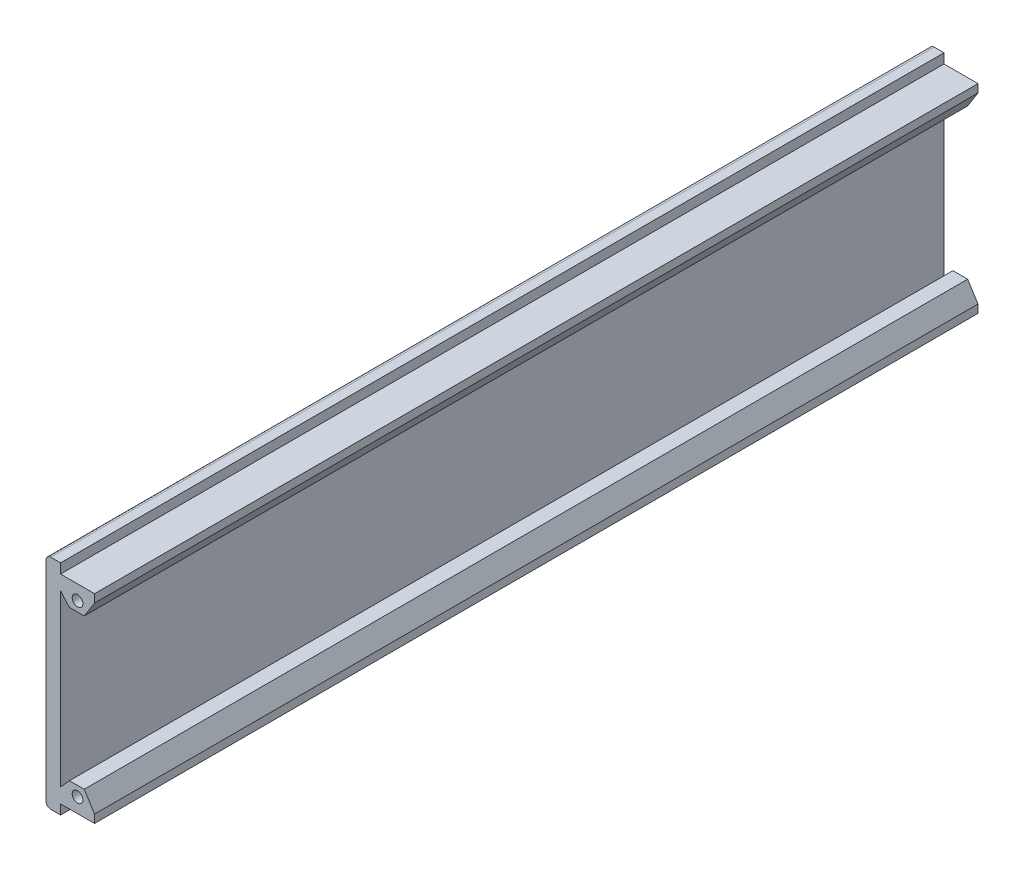
ISO-10303-21;
HEADER;
FILE_DESCRIPTION(('STEP AP214'),'2;1');
FILE_NAME('part.step','',(''),(''),'','','');
FILE_SCHEMA(('AUTOMOTIVE_DESIGN { 1 0 10303 214 1 1 1 1 }'));
ENDSEC;
DATA;
#1=APPLICATION_CONTEXT('core data for automotive mechanical design processes');
#2=APPLICATION_PROTOCOL_DEFINITION('international standard','automotive_design',2000,#1);
#3=PRODUCT_CONTEXT('',#1,'mechanical');
#4=PRODUCT('Part','Part','',(#3));
#5=PRODUCT_RELATED_PRODUCT_CATEGORY('part','',(#4));
#6=PRODUCT_DEFINITION_FORMATION('','',#4);
#7=PRODUCT_DEFINITION_CONTEXT('part definition',#1,'design');
#8=PRODUCT_DEFINITION('design','',#6,#7);
#9=PRODUCT_DEFINITION_SHAPE('','',#8);
#10=(LENGTH_UNIT() NAMED_UNIT(*) SI_UNIT(.MILLI.,.METRE.));
#11=(NAMED_UNIT(*) PLANE_ANGLE_UNIT() SI_UNIT($,.RADIAN.));
#12=(NAMED_UNIT(*) SI_UNIT($,.STERADIAN.) SOLID_ANGLE_UNIT());
#13=UNCERTAINTY_MEASURE_WITH_UNIT(LENGTH_MEASURE(1.E-05),#10,'distance_accuracy_value','');
#14=(GEOMETRIC_REPRESENTATION_CONTEXT(3) GLOBAL_UNCERTAINTY_ASSIGNED_CONTEXT((#13)) GLOBAL_UNIT_ASSIGNED_CONTEXT((#10,
#11,#12)) REPRESENTATION_CONTEXT('',''));
#15=CARTESIAN_POINT('',(0.,0.,0.));
#16=DIRECTION('',(0.,0.,1.));
#17=DIRECTION('',(1.,0.,0.));
#18=AXIS2_PLACEMENT_3D('',#15,#16,#17);
#19=CARTESIAN_POINT('',(0.,45.,182.));
#20=DIRECTION('',(0.,1.,0.));
#21=DIRECTION('',(0.,0.,1.));
#22=AXIS2_PLACEMENT_3D('',#19,#20,#21);
#23=PLANE('',#22);
#24=DIRECTION('',(1.,0.,0.));
#25=VECTOR('',#24,1.);
#26=CARTESIAN_POINT('',(0.,45.,0.));
#27=LINE('',#26,#25);
#28=CARTESIAN_POINT('',(1.,45.,0.));
#29=VERTEX_POINT('',#28);
#30=CARTESIAN_POINT('',(3.,45.,0.));
#31=VERTEX_POINT('',#30);
#32=EDGE_CURVE('E193',#29,#31,#27,.T.);
#33=ORIENTED_EDGE('',*,*,#32,.F.);
#34=DIRECTION('',(0.,0.,-1.));
#35=VECTOR('',#34,1.);
#36=CARTESIAN_POINT('',(1.,45.,182.));
#37=LINE('',#36,#35);
#38=CARTESIAN_POINT('',(1.,45.,182.));
#39=VERTEX_POINT('',#38);
#40=EDGE_CURVE('E11',#39,#29,#37,.T.);
#41=ORIENTED_EDGE('',*,*,#40,.F.);
#42=DIRECTION('',(1.,0.,0.));
#43=VECTOR('',#42,1.);
#44=CARTESIAN_POINT('',(0.,45.,182.));
#45=LINE('',#44,#43);
#46=CARTESIAN_POINT('',(3.,45.,182.));
#47=VERTEX_POINT('',#46);
#48=EDGE_CURVE('E242',#39,#47,#45,.T.);
#49=ORIENTED_EDGE('',*,*,#48,.T.);
#50=DIRECTION('',(0.,0.,-1.));
#51=VECTOR('',#50,1.);
#52=CARTESIAN_POINT('',(3.,45.,182.));
#53=LINE('',#52,#51);
#54=EDGE_CURVE('E112',#47,#31,#53,.T.);
#55=ORIENTED_EDGE('',*,*,#54,.T.);
#56=EDGE_LOOP('',(#33,#41,#49,#55));
#57=FACE_BOUND('',#56,.T.);
#58=ADVANCED_FACE('F32',(#57),#23,.T.);
#59=CARTESIAN_POINT('',(1.,44.,182.));
#60=DIRECTION('',(0.,0.,-1.));
#61=DIRECTION('',(-1.,0.,0.));
#62=AXIS2_PLACEMENT_3D('',#59,#60,#61);
#63=CYLINDRICAL_SURFACE('',#62,1.);
#64=CARTESIAN_POINT('',(1.,44.,0.));
#65=DIRECTION('',(0.,0.,1.));
#66=DIRECTION('',(1.,0.,0.));
#67=AXIS2_PLACEMENT_3D('',#64,#65,#66);
#68=CIRCLE('',#67,1.);
#69=CARTESIAN_POINT('',(0.,44.,0.));
#70=VERTEX_POINT('',#69);
#71=EDGE_CURVE('E196',#29,#70,#68,.T.);
#72=ORIENTED_EDGE('',*,*,#71,.T.);
#73=DIRECTION('',(0.,0.,-1.));
#74=VECTOR('',#73,1.);
#75=CARTESIAN_POINT('',(0.,44.,182.));
#76=LINE('',#75,#74);
#77=CARTESIAN_POINT('',(0.,44.,182.));
#78=VERTEX_POINT('',#77);
#79=EDGE_CURVE('E40',#78,#70,#76,.T.);
#80=ORIENTED_EDGE('',*,*,#79,.F.);
#81=CARTESIAN_POINT('',(1.,44.,182.));
#82=DIRECTION('',(0.,0.,1.));
#83=DIRECTION('',(1.,0.,0.));
#84=AXIS2_PLACEMENT_3D('',#81,#82,#83);
#85=CIRCLE('',#84,1.);
#86=EDGE_CURVE('E298',#39,#78,#85,.T.);
#87=ORIENTED_EDGE('',*,*,#86,.F.);
#88=ORIENTED_EDGE('',*,*,#40,.T.);
#89=EDGE_LOOP('',(#72,#80,#87,#88));
#90=FACE_BOUND('',#89,.T.);
#91=ADVANCED_FACE('F285',(#90),#63,.T.);
#92=CARTESIAN_POINT('',(0.,0.,182.));
#93=DIRECTION('',(-1.,0.,0.));
#94=DIRECTION('',(0.,0.,1.));
#95=AXIS2_PLACEMENT_3D('',#92,#93,#94);
#96=PLANE('',#95);
#97=DIRECTION('',(0.,1.,0.));
#98=VECTOR('',#97,1.);
#99=CARTESIAN_POINT('',(0.,0.,0.));
#100=LINE('',#99,#98);
#101=CARTESIAN_POINT('',(0.,1.00000000000001,0.));
#102=VERTEX_POINT('',#101);
#103=EDGE_CURVE('E199',#102,#70,#100,.T.);
#104=ORIENTED_EDGE('',*,*,#103,.F.);
#105=DIRECTION('',(0.,0.,-1.));
#106=VECTOR('',#105,1.);
#107=CARTESIAN_POINT('',(0.,1.00000000000001,182.));
#108=LINE('',#107,#106);
#109=CARTESIAN_POINT('',(0.,1.00000000000001,182.));
#110=VERTEX_POINT('',#109);
#111=EDGE_CURVE('E275',#110,#102,#108,.T.);
#112=ORIENTED_EDGE('',*,*,#111,.F.);
#113=DIRECTION('',(0.,1.,0.));
#114=VECTOR('',#113,1.);
#115=CARTESIAN_POINT('',(0.,0.,182.));
#116=LINE('',#115,#114);
#117=EDGE_CURVE('E282',#110,#78,#116,.T.);
#118=ORIENTED_EDGE('',*,*,#117,.T.);
#119=ORIENTED_EDGE('',*,*,#79,.T.);
#120=EDGE_LOOP('',(#104,#112,#118,#119));
#121=FACE_BOUND('',#120,.T.);
#122=ADVANCED_FACE('F280',(#121),#96,.T.);
#123=CARTESIAN_POINT('',(1.,1.,182.));
#124=DIRECTION('',(0.,0.,-1.));
#125=DIRECTION('',(-1.,0.,0.));
#126=AXIS2_PLACEMENT_3D('',#123,#124,#125);
#127=CYLINDRICAL_SURFACE('',#126,1.);
#128=CARTESIAN_POINT('',(1.,1.,0.));
#129=DIRECTION('',(0.,0.,1.));
#130=DIRECTION('',(1.,0.,0.));
#131=AXIS2_PLACEMENT_3D('',#128,#129,#130);
#132=CIRCLE('',#131,1.);
#133=CARTESIAN_POINT('',(1.00000000000001,0.,0.));
#134=VERTEX_POINT('',#133);
#135=EDGE_CURVE('E202',#134,#102,#132,.F.);
#136=ORIENTED_EDGE('',*,*,#135,.F.);
#137=DIRECTION('',(0.,0.,-1.));
#138=VECTOR('',#137,1.);
#139=CARTESIAN_POINT('',(1.00000000000001,0.,182.));
#140=LINE('',#139,#138);
#141=CARTESIAN_POINT('',(1.00000000000001,0.,182.));
#142=VERTEX_POINT('',#141);
#143=EDGE_CURVE('E273',#142,#134,#140,.T.);
#144=ORIENTED_EDGE('',*,*,#143,.F.);
#145=CARTESIAN_POINT('',(1.,1.,182.));
#146=DIRECTION('',(0.,0.,1.));
#147=DIRECTION('',(1.,0.,0.));
#148=AXIS2_PLACEMENT_3D('',#145,#146,#147);
#149=CIRCLE('',#148,1.);
#150=EDGE_CURVE('E297',#142,#110,#149,.F.);
#151=ORIENTED_EDGE('',*,*,#150,.T.);
#152=ORIENTED_EDGE('',*,*,#111,.T.);
#153=EDGE_LOOP('',(#136,#144,#151,#152));
#154=FACE_BOUND('',#153,.T.);
#155=ADVANCED_FACE('F293',(#154),#127,.T.);
#156=CARTESIAN_POINT('',(0.,0.,182.));
#157=DIRECTION('',(0.,1.,0.));
#158=DIRECTION('',(0.,0.,1.));
#159=AXIS2_PLACEMENT_3D('',#156,#157,#158);
#160=PLANE('',#159);
#161=DIRECTION('',(1.,0.,0.));
#162=VECTOR('',#161,1.);
#163=CARTESIAN_POINT('',(0.,0.,0.));
#164=LINE('',#163,#162);
#165=CARTESIAN_POINT('',(3.,0.,0.));
#166=VERTEX_POINT('',#165);
#167=EDGE_CURVE('E205',#134,#166,#164,.T.);
#168=ORIENTED_EDGE('',*,*,#167,.T.);
#169=DIRECTION('',(0.,0.,-1.));
#170=VECTOR('',#169,1.);
#171=CARTESIAN_POINT('',(3.,0.,182.));
#172=LINE('',#171,#170);
#173=CARTESIAN_POINT('',(3.,0.,182.));
#174=VERTEX_POINT('',#173);
#175=EDGE_CURVE('E270',#174,#166,#172,.T.);
#176=ORIENTED_EDGE('',*,*,#175,.F.);
#177=DIRECTION('',(1.,0.,0.));
#178=VECTOR('',#177,1.);
#179=CARTESIAN_POINT('',(0.,0.,182.));
#180=LINE('',#179,#178);
#181=EDGE_CURVE('E300',#142,#174,#180,.T.);
#182=ORIENTED_EDGE('',*,*,#181,.F.);
#183=ORIENTED_EDGE('',*,*,#143,.T.);
#184=EDGE_LOOP('',(#168,#176,#182,#183));
#185=FACE_BOUND('',#184,.T.);
#186=ADVANCED_FACE('F341',(#185),#160,.F.);
#187=CARTESIAN_POINT('',(3.,0.,182.));
#188=DIRECTION('',(-1.,0.,0.));
#189=DIRECTION('',(0.,0.,1.));
#190=AXIS2_PLACEMENT_3D('',#187,#188,#189);
#191=PLANE('',#190);
#192=DIRECTION('',(0.,1.,0.));
#193=VECTOR('',#192,1.);
#194=CARTESIAN_POINT('',(3.,0.,0.));
#195=LINE('',#194,#193);
#196=CARTESIAN_POINT('',(3.,2.,0.));
#197=VERTEX_POINT('',#196);
#198=EDGE_CURVE('E207',#166,#197,#195,.T.);
#199=ORIENTED_EDGE('',*,*,#198,.T.);
#200=DIRECTION('',(0.,0.,-1.));
#201=VECTOR('',#200,1.);
#202=CARTESIAN_POINT('',(3.,2.,182.));
#203=LINE('',#202,#201);
#204=CARTESIAN_POINT('',(3.,2.,182.));
#205=VERTEX_POINT('',#204);
#206=EDGE_CURVE('E267',#205,#197,#203,.T.);
#207=ORIENTED_EDGE('',*,*,#206,.F.);
#208=DIRECTION('',(0.,1.,0.));
#209=VECTOR('',#208,1.);
#210=CARTESIAN_POINT('',(3.,0.,182.));
#211=LINE('',#210,#209);
#212=EDGE_CURVE('E306',#174,#205,#211,.T.);
#213=ORIENTED_EDGE('',*,*,#212,.F.);
#214=ORIENTED_EDGE('',*,*,#175,.T.);
#215=EDGE_LOOP('',(#199,#207,#213,#214));
#216=FACE_BOUND('',#215,.T.);
#217=ADVANCED_FACE('F344',(#216),#191,.F.);
#218=CARTESIAN_POINT('',(0.,2.,182.));
#219=DIRECTION('',(0.,1.,0.));
#220=DIRECTION('',(0.,0.,1.));
#221=AXIS2_PLACEMENT_3D('',#218,#219,#220);
#222=PLANE('',#221);
#223=DIRECTION('',(1.,0.,0.));
#224=VECTOR('',#223,1.);
#225=CARTESIAN_POINT('',(0.,2.,0.));
#226=LINE('',#225,#224);
#227=CARTESIAN_POINT('',(10.,2.,0.));
#228=VERTEX_POINT('',#227);
#229=EDGE_CURVE('E209',#197,#228,#226,.T.);
#230=ORIENTED_EDGE('',*,*,#229,.T.);
#231=DIRECTION('',(0.,0.,-1.));
#232=VECTOR('',#231,1.);
#233=CARTESIAN_POINT('',(10.,2.,182.));
#234=LINE('',#233,#232);
#235=CARTESIAN_POINT('',(10.,2.,182.));
#236=VERTEX_POINT('',#235);
#237=EDGE_CURVE('E264',#236,#228,#234,.T.);
#238=ORIENTED_EDGE('',*,*,#237,.F.);
#239=DIRECTION('',(1.,0.,0.));
#240=VECTOR('',#239,1.);
#241=CARTESIAN_POINT('',(0.,2.,182.));
#242=LINE('',#241,#240);
#243=EDGE_CURVE('E308',#205,#236,#242,.T.);
#244=ORIENTED_EDGE('',*,*,#243,.F.);
#245=ORIENTED_EDGE('',*,*,#206,.T.);
#246=EDGE_LOOP('',(#230,#238,#244,#245));
#247=FACE_BOUND('',#246,.T.);
#248=ADVANCED_FACE('F348',(#247),#222,.F.);
#249=CARTESIAN_POINT('',(10.,0.,182.));
#250=DIRECTION('',(-1.,0.,0.));
#251=DIRECTION('',(0.,0.,1.));
#252=AXIS2_PLACEMENT_3D('',#249,#250,#251);
#253=PLANE('',#252);
#254=DIRECTION('',(0.,1.,0.));
#255=VECTOR('',#254,1.);
#256=CARTESIAN_POINT('',(10.,0.,0.));
#257=LINE('',#256,#255);
#258=CARTESIAN_POINT('',(10.,3.67579682857385,0.));
#259=VERTEX_POINT('',#258);
#260=EDGE_CURVE('E211',#228,#259,#257,.T.);
#261=ORIENTED_EDGE('',*,*,#260,.T.);
#262=DIRECTION('',(0.,0.,-1.));
#263=VECTOR('',#262,1.);
#264=CARTESIAN_POINT('',(10.,3.67579682857385,182.));
#265=LINE('',#264,#263);
#266=CARTESIAN_POINT('',(10.,3.67579682857385,182.));
#267=VERTEX_POINT('',#266);
#268=EDGE_CURVE('E261',#267,#259,#265,.T.);
#269=ORIENTED_EDGE('',*,*,#268,.F.);
#270=DIRECTION('',(0.,1.,0.));
#271=VECTOR('',#270,1.);
#272=CARTESIAN_POINT('',(10.,0.,182.));
#273=LINE('',#272,#271);
#274=EDGE_CURVE('E310',#236,#267,#273,.T.);
#275=ORIENTED_EDGE('',*,*,#274,.F.);
#276=ORIENTED_EDGE('',*,*,#237,.T.);
#277=EDGE_LOOP('',(#261,#269,#275,#276));
#278=FACE_BOUND('',#277,.T.);
#279=ADVANCED_FACE('F352',(#278),#253,.F.);
#280=CARTESIAN_POINT('',(8.81045851732208,5.56056902407851,182.));
#281=DIRECTION('',(-0.845659214489006,-0.533723236284347,0.));
#282=DIRECTION('',(0.533723236284347,-0.845659214489006,0.));
#283=AXIS2_PLACEMENT_3D('',#280,#281,#282);
#284=PLANE('',#283);
#285=DIRECTION('',(-0.533723236284347,0.845659214489006,0.));
#286=VECTOR('',#285,1.);
#287=CARTESIAN_POINT('',(8.81045851732208,5.56056902407851,0.));
#288=LINE('',#287,#286);
#289=CARTESIAN_POINT('',(7.87348653181208,7.04515680178294,0.));
#290=VERTEX_POINT('',#289);
#291=EDGE_CURVE('E213',#259,#290,#288,.T.);
#292=ORIENTED_EDGE('',*,*,#291,.T.);
#293=DIRECTION('',(0.,0.,-1.));
#294=VECTOR('',#293,1.);
#295=CARTESIAN_POINT('',(7.87348653181208,7.04515680178294,182.));
#296=LINE('',#295,#294);
#297=CARTESIAN_POINT('',(7.87348653181208,7.04515680178294,182.));
#298=VERTEX_POINT('',#297);
#299=EDGE_CURVE('E258',#298,#290,#296,.T.);
#300=ORIENTED_EDGE('',*,*,#299,.F.);
#301=DIRECTION('',(-0.533723236284347,0.845659214489006,0.));
#302=VECTOR('',#301,1.);
#303=CARTESIAN_POINT('',(8.81045851732208,5.56056902407851,182.));
#304=LINE('',#303,#302);
#305=EDGE_CURVE('E312',#267,#298,#304,.T.);
#306=ORIENTED_EDGE('',*,*,#305,.F.);
#307=ORIENTED_EDGE('',*,*,#268,.T.);
#308=EDGE_LOOP('',(#292,#300,#306,#307));
#309=FACE_BOUND('',#308,.T.);
#310=ADVANCED_FACE('F356',(#309),#284,.F.);
#311=CARTESIAN_POINT('',(0.,7.04515680178293,182.));
#312=DIRECTION('',(0.,-1.,0.));
#313=DIRECTION('',(1.,0.,0.));
#314=AXIS2_PLACEMENT_3D('',#311,#312,#313);
#315=PLANE('',#314);
#316=DIRECTION('',(-1.,0.,0.));
#317=VECTOR('',#316,1.);
#318=CARTESIAN_POINT('',(0.,7.04515680178293,0.));
#319=LINE('',#318,#317);
#320=CARTESIAN_POINT('',(4.83298828549779,7.04515680178294,0.));
#321=VERTEX_POINT('',#320);
#322=EDGE_CURVE('E215',#290,#321,#319,.T.);
#323=ORIENTED_EDGE('',*,*,#322,.T.);
#324=DIRECTION('',(0.,0.,-1.));
#325=VECTOR('',#324,1.);
#326=CARTESIAN_POINT('',(4.83298828549779,7.04515680178294,182.));
#327=LINE('',#326,#325);
#328=CARTESIAN_POINT('',(4.83298828549779,7.04515680178294,182.));
#329=VERTEX_POINT('',#328);
#330=EDGE_CURVE('E255',#329,#321,#327,.T.);
#331=ORIENTED_EDGE('',*,*,#330,.F.);
#332=DIRECTION('',(-1.,0.,0.));
#333=VECTOR('',#332,1.);
#334=CARTESIAN_POINT('',(0.,7.04515680178293,182.));
#335=LINE('',#334,#333);
#336=EDGE_CURVE('E314',#298,#329,#335,.T.);
#337=ORIENTED_EDGE('',*,*,#336,.F.);
#338=ORIENTED_EDGE('',*,*,#299,.T.);
#339=EDGE_LOOP('',(#323,#331,#337,#338));
#340=FACE_BOUND('',#339,.T.);
#341=ADVANCED_FACE('F360',(#340),#315,.F.);
#342=CARTESIAN_POINT('',(-0.821442901153496,0.736224828192653,182.));
#343=DIRECTION('',(0.744678121456359,-0.667423774991742,0.));
#344=DIRECTION('',(0.667423774991742,0.744678121456359,0.));
#345=AXIS2_PLACEMENT_3D('',#342,#343,#344);
#346=PLANE('',#345);
#347=DIRECTION('',(-0.667423774991742,-0.744678121456359,0.));
#348=VECTOR('',#347,1.);
#349=CARTESIAN_POINT('',(-0.821442901153496,0.736224828192653,0.));
#350=LINE('',#349,#348);
#351=CARTESIAN_POINT('',(3.,5.,0.));
#352=VERTEX_POINT('',#351);
#353=EDGE_CURVE('E217',#321,#352,#350,.T.);
#354=ORIENTED_EDGE('',*,*,#353,.T.);
#355=DIRECTION('',(0.,0.,-1.));
#356=VECTOR('',#355,1.);
#357=CARTESIAN_POINT('',(3.,5.,182.));
#358=LINE('',#357,#356);
#359=CARTESIAN_POINT('',(3.,5.,182.));
#360=VERTEX_POINT('',#359);
#361=EDGE_CURVE('E252',#360,#352,#358,.T.);
#362=ORIENTED_EDGE('',*,*,#361,.F.);
#363=DIRECTION('',(-0.667423774991742,-0.744678121456359,0.));
#364=VECTOR('',#363,1.);
#365=CARTESIAN_POINT('',(-0.821442901153496,0.736224828192653,182.));
#366=LINE('',#365,#364);
#367=EDGE_CURVE('E316',#329,#360,#366,.T.);
#368=ORIENTED_EDGE('',*,*,#367,.F.);
#369=ORIENTED_EDGE('',*,*,#330,.T.);
#370=EDGE_LOOP('',(#354,#362,#368,#369));
#371=FACE_BOUND('',#370,.T.);
#372=ADVANCED_FACE('F364',(#371),#346,.F.);
#373=CARTESIAN_POINT('',(3.,0.,182.));
#374=DIRECTION('',(-1.,0.,0.));
#375=DIRECTION('',(0.,0.,1.));
#376=AXIS2_PLACEMENT_3D('',#373,#374,#375);
#377=PLANE('',#376);
#378=DIRECTION('',(0.,1.,0.));
#379=VECTOR('',#378,1.);
#380=CARTESIAN_POINT('',(3.,0.,0.));
#381=LINE('',#380,#379);
#382=CARTESIAN_POINT('',(3.,40.,0.));
#383=VERTEX_POINT('',#382);
#384=EDGE_CURVE('E219',#352,#383,#381,.T.);
#385=ORIENTED_EDGE('',*,*,#384,.T.);
#386=DIRECTION('',(0.,0.,-1.));
#387=VECTOR('',#386,1.);
#388=CARTESIAN_POINT('',(3.,40.,182.));
#389=LINE('',#388,#387);
#390=CARTESIAN_POINT('',(3.,40.,182.));
#391=VERTEX_POINT('',#390);
#392=EDGE_CURVE('E250',#391,#383,#389,.T.);
#393=ORIENTED_EDGE('',*,*,#392,.F.);
#394=DIRECTION('',(0.,1.,0.));
#395=VECTOR('',#394,1.);
#396=CARTESIAN_POINT('',(3.,0.,182.));
#397=LINE('',#396,#395);
#398=EDGE_CURVE('E318',#360,#391,#397,.T.);
#399=ORIENTED_EDGE('',*,*,#398,.F.);
#400=ORIENTED_EDGE('',*,*,#361,.T.);
#401=EDGE_LOOP('',(#385,#393,#399,#400));
#402=FACE_BOUND('',#401,.T.);
#403=ADVANCED_FACE('F368',(#402),#377,.F.);
#404=CARTESIAN_POINT('',(21.5442718327738,19.3092274658977,182.));
#405=DIRECTION('',(-0.744678121456358,-0.667423774991743,0.));
#406=DIRECTION('',(0.667423774991743,-0.744678121456358,0.));
#407=AXIS2_PLACEMENT_3D('',#404,#405,#406);
#408=PLANE('',#407);
#409=DIRECTION('',(-0.667423774991743,0.744678121456358,0.));
#410=VECTOR('',#409,1.);
#411=CARTESIAN_POINT('',(21.5442718327738,19.3092274658977,0.));
#412=LINE('',#411,#410);
#413=CARTESIAN_POINT('',(4.83298828549779,37.9548431982171,0.));
#414=VERTEX_POINT('',#413);
#415=EDGE_CURVE('E222',#414,#383,#412,.T.);
#416=ORIENTED_EDGE('',*,*,#415,.F.);
#417=DIRECTION('',(0.,0.,-1.));
#418=VECTOR('',#417,1.);
#419=CARTESIAN_POINT('',(4.83298828549779,37.9548431982171,182.));
#420=LINE('',#419,#418);
#421=CARTESIAN_POINT('',(4.83298828549779,37.9548431982171,182.));
#422=VERTEX_POINT('',#421);
#423=EDGE_CURVE('E248',#422,#414,#420,.T.);
#424=ORIENTED_EDGE('',*,*,#423,.F.);
#425=DIRECTION('',(-0.667423774991743,0.744678121456358,0.));
#426=VECTOR('',#425,1.);
#427=CARTESIAN_POINT('',(21.5442718327738,19.3092274658977,182.));
#428=LINE('',#427,#426);
#429=EDGE_CURVE('E320',#422,#391,#428,.T.);
#430=ORIENTED_EDGE('',*,*,#429,.T.);
#431=ORIENTED_EDGE('',*,*,#392,.T.);
#432=EDGE_LOOP('',(#416,#424,#430,#431));
#433=FACE_BOUND('',#432,.T.);
#434=ADVANCED_FACE('F372',(#433),#408,.T.);
#435=CARTESIAN_POINT('',(0.,37.9548431982171,182.));
#436=DIRECTION('',(0.,-1.,0.));
#437=DIRECTION('',(0.,0.,-1.));
#438=AXIS2_PLACEMENT_3D('',#435,#436,#437);
#439=PLANE('',#438);
#440=DIRECTION('',(-1.,0.,0.));
#441=VECTOR('',#440,1.);
#442=CARTESIAN_POINT('',(0.,37.9548431982171,0.));
#443=LINE('',#442,#441);
#444=CARTESIAN_POINT('',(7.87348653181208,37.9548431982171,0.));
#445=VERTEX_POINT('',#444);
#446=EDGE_CURVE('E225',#445,#414,#443,.T.);
#447=ORIENTED_EDGE('',*,*,#446,.F.);
#448=DIRECTION('',(0.,0.,-1.));
#449=VECTOR('',#448,1.);
#450=CARTESIAN_POINT('',(7.87348653181208,37.9548431982171,182.));
#451=LINE('',#450,#449);
#452=CARTESIAN_POINT('',(7.87348653181208,37.9548431982171,182.));
#453=VERTEX_POINT('',#452);
#454=EDGE_CURVE('E246',#453,#445,#451,.T.);
#455=ORIENTED_EDGE('',*,*,#454,.F.);
#456=DIRECTION('',(-1.,0.,0.));
#457=VECTOR('',#456,1.);
#458=CARTESIAN_POINT('',(0.,37.9548431982171,182.));
#459=LINE('',#458,#457);
#460=EDGE_CURVE('E323',#453,#422,#459,.T.);
#461=ORIENTED_EDGE('',*,*,#460,.T.);
#462=ORIENTED_EDGE('',*,*,#423,.T.);
#463=EDGE_LOOP('',(#447,#455,#461,#462));
#464=FACE_BOUND('',#463,.T.);
#465=ADVANCED_FACE('F376',(#464),#439,.T.);
#466=CARTESIAN_POINT('',(-11.5002002564617,7.25815315866415,182.));
#467=DIRECTION('',(0.845659214489006,-0.533723236284347,0.));
#468=DIRECTION('',(0.533723236284347,0.845659214489006,0.));
#469=AXIS2_PLACEMENT_3D('',#466,#467,#468);
#470=PLANE('',#469);
#471=DIRECTION('',(-0.533723236284347,-0.845659214489006,0.));
#472=VECTOR('',#471,1.);
#473=CARTESIAN_POINT('',(-11.5002002564617,7.25815315866415,0.));
#474=LINE('',#473,#472);
#475=CARTESIAN_POINT('',(10.,41.3242031714262,0.));
#476=VERTEX_POINT('',#475);
#477=EDGE_CURVE('E228',#476,#445,#474,.T.);
#478=ORIENTED_EDGE('',*,*,#477,.F.);
#479=DIRECTION('',(0.,0.,-1.));
#480=VECTOR('',#479,1.);
#481=CARTESIAN_POINT('',(10.,41.3242031714262,182.));
#482=LINE('',#481,#480);
#483=CARTESIAN_POINT('',(10.,41.3242031714262,182.));
#484=VERTEX_POINT('',#483);
#485=EDGE_CURVE('E172',#484,#476,#482,.T.);
#486=ORIENTED_EDGE('',*,*,#485,.F.);
#487=DIRECTION('',(-0.533723236284347,-0.845659214489006,0.));
#488=VECTOR('',#487,1.);
#489=CARTESIAN_POINT('',(-11.5002002564617,7.25815315866415,182.));
#490=LINE('',#489,#488);
#491=EDGE_CURVE('E180',#484,#453,#490,.T.);
#492=ORIENTED_EDGE('',*,*,#491,.T.);
#493=ORIENTED_EDGE('',*,*,#454,.T.);
#494=EDGE_LOOP('',(#478,#486,#492,#493));
#495=FACE_BOUND('',#494,.T.);
#496=ADVANCED_FACE('F327',(#495),#470,.T.);
#497=CARTESIAN_POINT('',(10.,0.,182.));
#498=DIRECTION('',(1.,0.,0.));
#499=DIRECTION('',(0.,0.,-1.));
#500=AXIS2_PLACEMENT_3D('',#497,#498,#499);
#501=PLANE('',#500);
#502=DIRECTION('',(0.,-1.,0.));
#503=VECTOR('',#502,1.);
#504=CARTESIAN_POINT('',(10.,0.,0.));
#505=LINE('',#504,#503);
#506=CARTESIAN_POINT('',(10.,43.,0.));
#507=VERTEX_POINT('',#506);
#508=EDGE_CURVE('E167',#507,#476,#505,.T.);
#509=ORIENTED_EDGE('',*,*,#508,.F.);
#510=DIRECTION('',(0.,0.,-1.));
#511=VECTOR('',#510,1.);
#512=CARTESIAN_POINT('',(10.,43.,182.));
#513=LINE('',#512,#511);
#514=CARTESIAN_POINT('',(10.,43.,182.));
#515=VERTEX_POINT('',#514);
#516=EDGE_CURVE('E162',#515,#507,#513,.T.);
#517=ORIENTED_EDGE('',*,*,#516,.F.);
#518=DIRECTION('',(0.,-1.,0.));
#519=VECTOR('',#518,1.);
#520=CARTESIAN_POINT('',(10.,0.,182.));
#521=LINE('',#520,#519);
#522=EDGE_CURVE('E165',#515,#484,#521,.T.);
#523=ORIENTED_EDGE('',*,*,#522,.T.);
#524=ORIENTED_EDGE('',*,*,#485,.T.);
#525=EDGE_LOOP('',(#509,#517,#523,#524));
#526=FACE_BOUND('',#525,.T.);
#527=ADVANCED_FACE('F164',(#526),#501,.T.);
#528=CARTESIAN_POINT('',(0.,43.,182.));
#529=DIRECTION('',(0.,1.,0.));
#530=DIRECTION('',(0.,0.,1.));
#531=AXIS2_PLACEMENT_3D('',#528,#529,#530);
#532=PLANE('',#531);
#533=DIRECTION('',(1.,0.,0.));
#534=VECTOR('',#533,1.);
#535=CARTESIAN_POINT('',(0.,43.,0.));
#536=LINE('',#535,#534);
#537=CARTESIAN_POINT('',(3.,43.,0.));
#538=VERTEX_POINT('',#537);
#539=EDGE_CURVE('E232',#538,#507,#536,.T.);
#540=ORIENTED_EDGE('',*,*,#539,.F.);
#541=DIRECTION('',(0.,0.,-1.));
#542=VECTOR('',#541,1.);
#543=CARTESIAN_POINT('',(3.,43.,182.));
#544=LINE('',#543,#542);
#545=CARTESIAN_POINT('',(3.,43.,182.));
#546=VERTEX_POINT('',#545);
#547=EDGE_CURVE('E105',#546,#538,#544,.T.);
#548=ORIENTED_EDGE('',*,*,#547,.F.);
#549=DIRECTION('',(1.,0.,0.));
#550=VECTOR('',#549,1.);
#551=CARTESIAN_POINT('',(0.,43.,182.));
#552=LINE('',#551,#550);
#553=EDGE_CURVE('E177',#546,#515,#552,.T.);
#554=ORIENTED_EDGE('',*,*,#553,.T.);
#555=ORIENTED_EDGE('',*,*,#516,.T.);
#556=EDGE_LOOP('',(#540,#548,#554,#555));
#557=FACE_BOUND('',#556,.T.);
#558=ADVANCED_FACE('F182',(#557),#532,.T.);
#559=CARTESIAN_POINT('',(6.50000000000001,5.,182.));
#560=DIRECTION('',(0.,0.,-1.));
#561=DIRECTION('',(-1.,0.,0.));
#562=AXIS2_PLACEMENT_3D('',#559,#560,#561);
#563=CYLINDRICAL_SURFACE('',#562,1.10285691074047);
#564=CARTESIAN_POINT('',(6.50000000000001,5.,182.));
#565=DIRECTION('',(0.,0.,1.));
#566=DIRECTION('',(1.,0.,0.));
#567=AXIS2_PLACEMENT_3D('',#564,#565,#566);
#568=CIRCLE('',#567,1.10285691074047);
#569=CARTESIAN_POINT('',(7.60285691074048,5.,182.));
#570=VERTEX_POINT('',#569);
#571=EDGE_CURVE('E184',#570,#570,#568,.T.);
#572=ORIENTED_EDGE('',*,*,#571,.T.);
#573=EDGE_LOOP('',(#572));
#574=FACE_BOUND('',#573,.T.);
#575=CARTESIAN_POINT('',(6.50000000000001,5.,0.));
#576=DIRECTION('',(0.,0.,1.));
#577=DIRECTION('',(1.,0.,0.));
#578=AXIS2_PLACEMENT_3D('',#575,#576,#577);
#579=CIRCLE('',#578,1.10285691074047);
#580=CARTESIAN_POINT('',(7.60285691074048,5.,0.));
#581=VERTEX_POINT('',#580);
#582=EDGE_CURVE('E236',#581,#581,#579,.T.);
#583=ORIENTED_EDGE('',*,*,#582,.F.);
#584=EDGE_LOOP('',(#583));
#585=FACE_BOUND('',#584,.T.);
#586=ADVANCED_FACE('F387',(#574,#585),#563,.F.);
#587=CARTESIAN_POINT('',(3.,0.,182.));
#588=DIRECTION('',(-1.,0.,0.));
#589=DIRECTION('',(0.,0.,1.));
#590=AXIS2_PLACEMENT_3D('',#587,#588,#589);
#591=PLANE('',#590);
#592=DIRECTION('',(0.,1.,0.));
#593=VECTOR('',#592,1.);
#594=CARTESIAN_POINT('',(3.,0.,0.));
#595=LINE('',#594,#593);
#596=EDGE_CURVE('E234',#538,#31,#595,.T.);
#597=ORIENTED_EDGE('',*,*,#596,.T.);
#598=ORIENTED_EDGE('',*,*,#54,.F.);
#599=DIRECTION('',(0.,1.,0.));
#600=VECTOR('',#599,1.);
#601=CARTESIAN_POINT('',(3.,0.,182.));
#602=LINE('',#601,#600);
#603=EDGE_CURVE('E48',#546,#47,#602,.T.);
#604=ORIENTED_EDGE('',*,*,#603,.F.);
#605=ORIENTED_EDGE('',*,*,#547,.T.);
#606=EDGE_LOOP('',(#597,#598,#604,#605));
#607=FACE_BOUND('',#606,.T.);
#608=ADVANCED_FACE('F329',(#607),#591,.F.);
#609=CARTESIAN_POINT('',(6.50000000000001,40.,182.));
#610=DIRECTION('',(0.,0.,-1.));
#611=DIRECTION('',(-1.,0.,0.));
#612=AXIS2_PLACEMENT_3D('',#609,#610,#611);
#613=CYLINDRICAL_SURFACE('',#612,1.10285691074047);
#614=CARTESIAN_POINT('',(6.50000000000001,40.,182.));
#615=DIRECTION('',(0.,0.,1.));
#616=DIRECTION('',(1.,0.,0.));
#617=AXIS2_PLACEMENT_3D('',#614,#615,#616);
#618=CIRCLE('',#617,1.10285691074047);
#619=CARTESIAN_POINT('',(7.60285691074048,40.,182.));
#620=VERTEX_POINT('',#619);
#621=EDGE_CURVE('E190',#620,#620,#618,.F.);
#622=ORIENTED_EDGE('',*,*,#621,.F.);
#623=EDGE_LOOP('',(#622));
#624=FACE_BOUND('',#623,.T.);
#625=CARTESIAN_POINT('',(6.50000000000001,40.,0.));
#626=DIRECTION('',(0.,0.,1.));
#627=DIRECTION('',(1.,0.,0.));
#628=AXIS2_PLACEMENT_3D('',#625,#626,#627);
#629=CIRCLE('',#628,1.10285691074047);
#630=CARTESIAN_POINT('',(7.60285691074048,40.,0.));
#631=VERTEX_POINT('',#630);
#632=EDGE_CURVE('E239',#631,#631,#629,.F.);
#633=ORIENTED_EDGE('',*,*,#632,.T.);
#634=EDGE_LOOP('',(#633));
#635=FACE_BOUND('',#634,.T.);
#636=ADVANCED_FACE('F390',(#624,#635),#613,.F.);
#637=CARTESIAN_POINT('',(0.,0.,182.));
#638=DIRECTION('',(0.,0.,1.));
#639=DIRECTION('',(1.,0.,0.));
#640=AXIS2_PLACEMENT_3D('',#637,#638,#639);
#641=PLANE('',#640);
#642=ORIENTED_EDGE('',*,*,#48,.F.);
#643=ORIENTED_EDGE('',*,*,#86,.T.);
#644=ORIENTED_EDGE('',*,*,#117,.F.);
#645=ORIENTED_EDGE('',*,*,#150,.F.);
#646=ORIENTED_EDGE('',*,*,#181,.T.);
#647=ORIENTED_EDGE('',*,*,#212,.T.);
#648=ORIENTED_EDGE('',*,*,#243,.T.);
#649=ORIENTED_EDGE('',*,*,#274,.T.);
#650=ORIENTED_EDGE('',*,*,#305,.T.);
#651=ORIENTED_EDGE('',*,*,#336,.T.);
#652=ORIENTED_EDGE('',*,*,#367,.T.);
#653=ORIENTED_EDGE('',*,*,#398,.T.);
#654=ORIENTED_EDGE('',*,*,#429,.F.);
#655=ORIENTED_EDGE('',*,*,#460,.F.);
#656=ORIENTED_EDGE('',*,*,#491,.F.);
#657=ORIENTED_EDGE('',*,*,#522,.F.);
#658=ORIENTED_EDGE('',*,*,#553,.F.);
#659=ORIENTED_EDGE('',*,*,#603,.T.);
#660=EDGE_LOOP('',(#642,#643,#644,#645,#646,#647,#648,#649,#650,#651,#652,#653,#654,#655,#656,
#657,#658,#659));
#661=FACE_BOUND('',#660,.T.);
#662=ORIENTED_EDGE('',*,*,#571,.F.);
#663=EDGE_LOOP('',(#662));
#664=FACE_BOUND('',#663,.T.);
#665=ORIENTED_EDGE('',*,*,#621,.T.);
#666=EDGE_LOOP('',(#665));
#667=FACE_BOUND('',#666,.T.);
#668=ADVANCED_FACE('F175',(#661,#664,#667),#641,.T.);
#669=CARTESIAN_POINT('',(0.,0.,0.));
#670=DIRECTION('',(0.,0.,1.));
#671=DIRECTION('',(1.,0.,0.));
#672=AXIS2_PLACEMENT_3D('',#669,#670,#671);
#673=PLANE('',#672);
#674=ORIENTED_EDGE('',*,*,#32,.T.);
#675=ORIENTED_EDGE('',*,*,#596,.F.);
#676=ORIENTED_EDGE('',*,*,#539,.T.);
#677=ORIENTED_EDGE('',*,*,#508,.T.);
#678=ORIENTED_EDGE('',*,*,#477,.T.);
#679=ORIENTED_EDGE('',*,*,#446,.T.);
#680=ORIENTED_EDGE('',*,*,#415,.T.);
#681=ORIENTED_EDGE('',*,*,#384,.F.);
#682=ORIENTED_EDGE('',*,*,#353,.F.);
#683=ORIENTED_EDGE('',*,*,#322,.F.);
#684=ORIENTED_EDGE('',*,*,#291,.F.);
#685=ORIENTED_EDGE('',*,*,#260,.F.);
#686=ORIENTED_EDGE('',*,*,#229,.F.);
#687=ORIENTED_EDGE('',*,*,#198,.F.);
#688=ORIENTED_EDGE('',*,*,#167,.F.);
#689=ORIENTED_EDGE('',*,*,#135,.T.);
#690=ORIENTED_EDGE('',*,*,#103,.T.);
#691=ORIENTED_EDGE('',*,*,#71,.F.);
#692=EDGE_LOOP('',(#674,#675,#676,#677,#678,#679,#680,#681,#682,#683,#684,#685,#686,#687,#688,
#689,#690,#691));
#693=FACE_BOUND('',#692,.T.);
#694=ORIENTED_EDGE('',*,*,#582,.T.);
#695=EDGE_LOOP('',(#694));
#696=FACE_BOUND('',#695,.T.);
#697=ORIENTED_EDGE('',*,*,#632,.F.);
#698=EDGE_LOOP('',(#697));
#699=FACE_BOUND('',#698,.T.);
#700=ADVANCED_FACE('F287',(#693,#696,#699),#673,.F.);
#701=CLOSED_SHELL('',(#58,#91,#122,#155,#186,#217,#248,#279,#310,#341,#372,#403,#434,#465,#496,
#527,#558,#586,#608,#636,#668,#700));
#702=MANIFOLD_SOLID_BREP('B2',#701);
#703=ADVANCED_BREP_SHAPE_REPRESENTATION('',(#18,#702),#14);
#704=SHAPE_DEFINITION_REPRESENTATION(#9,#703);
ENDSEC;
END-ISO-10303-21;
